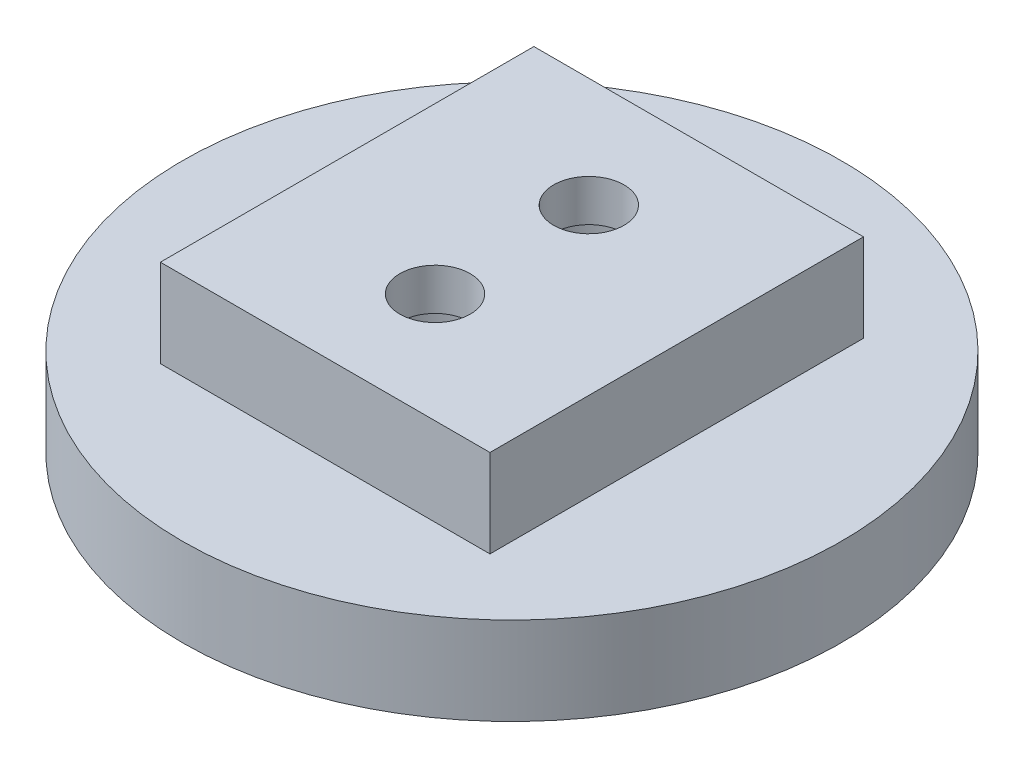
ISO-10303-21;
HEADER;
FILE_DESCRIPTION(('STEP AP214'),'2;1');
FILE_NAME('part.step','',(''),(''),'','','');
FILE_SCHEMA(('AUTOMOTIVE_DESIGN { 1 0 10303 214 1 1 1 1 }'));
ENDSEC;
DATA;
#1=APPLICATION_CONTEXT('core data for automotive mechanical design processes');
#2=APPLICATION_PROTOCOL_DEFINITION('international standard','automotive_design',2000,#1);
#3=PRODUCT_CONTEXT('',#1,'mechanical');
#4=PRODUCT('Part','Part','',(#3));
#5=PRODUCT_RELATED_PRODUCT_CATEGORY('part','',(#4));
#6=PRODUCT_DEFINITION_FORMATION('','',#4);
#7=PRODUCT_DEFINITION_CONTEXT('part definition',#1,'design');
#8=PRODUCT_DEFINITION('design','',#6,#7);
#9=PRODUCT_DEFINITION_SHAPE('','',#8);
#10=(LENGTH_UNIT() NAMED_UNIT(*) SI_UNIT(.MILLI.,.METRE.));
#11=(NAMED_UNIT(*) PLANE_ANGLE_UNIT() SI_UNIT($,.RADIAN.));
#12=(NAMED_UNIT(*) SI_UNIT($,.STERADIAN.) SOLID_ANGLE_UNIT());
#13=UNCERTAINTY_MEASURE_WITH_UNIT(LENGTH_MEASURE(1.E-05),#10,'distance_accuracy_value','');
#14=(GEOMETRIC_REPRESENTATION_CONTEXT(3) GLOBAL_UNCERTAINTY_ASSIGNED_CONTEXT((#13)) GLOBAL_UNIT_ASSIGNED_CONTEXT((#10,
#11,#12)) REPRESENTATION_CONTEXT('',''));
#15=CARTESIAN_POINT('',(0.,0.,0.));
#16=DIRECTION('',(0.,0.,1.));
#17=DIRECTION('',(1.,0.,0.));
#18=AXIS2_PLACEMENT_3D('',#15,#16,#17);
#19=CARTESIAN_POINT('',(0.,0.,0.));
#20=DIRECTION('',(0.,1.,0.));
#21=DIRECTION('',(0.,0.,1.));
#22=AXIS2_PLACEMENT_3D('',#19,#20,#21);
#23=PLANE('',#22);
#24=CARTESIAN_POINT('',(0.,0.,0.));
#25=DIRECTION('',(0.,1.,0.));
#26=DIRECTION('',(0.,0.,1.));
#27=AXIS2_PLACEMENT_3D('',#24,#25,#26);
#28=CIRCLE('',#27,15.);
#29=CARTESIAN_POINT('',(0.,0.,15.));
#30=VERTEX_POINT('',#29);
#31=EDGE_CURVE('E49',#30,#30,#28,.T.);
#32=ORIENTED_EDGE('',*,*,#31,.F.);
#33=EDGE_LOOP('',(#32));
#34=FACE_BOUND('',#33,.T.);
#35=CARTESIAN_POINT('',(0.,0.,3.5));
#36=DIRECTION('',(0.,-1.,0.));
#37=DIRECTION('',(0.,0.,-1.));
#38=AXIS2_PLACEMENT_3D('',#35,#36,#37);
#39=CIRCLE('',#38,2.95);
#40=CARTESIAN_POINT('',(0.,0.,0.55));
#41=VERTEX_POINT('',#40);
#42=EDGE_CURVE('E132',#41,#41,#39,.T.);
#43=ORIENTED_EDGE('',*,*,#42,.F.);
#44=EDGE_LOOP('',(#43));
#45=FACE_BOUND('',#44,.T.);
#46=CARTESIAN_POINT('',(0.,0.,-3.5));
#47=DIRECTION('',(0.,1.,0.));
#48=DIRECTION('',(0.,0.,1.));
#49=AXIS2_PLACEMENT_3D('',#46,#47,#48);
#50=CIRCLE('',#49,2.95);
#51=CARTESIAN_POINT('',(0.,0.,-0.55));
#52=VERTEX_POINT('',#51);
#53=EDGE_CURVE('E126',#52,#52,#50,.T.);
#54=ORIENTED_EDGE('',*,*,#53,.T.);
#55=EDGE_LOOP('',(#54));
#56=FACE_BOUND('',#55,.T.);
#57=ADVANCED_FACE('F39',(#34,#45,#56),#23,.F.);
#58=CARTESIAN_POINT('',(0.,0.,3.5));
#59=DIRECTION('',(0.,1.,0.));
#60=DIRECTION('',(0.,0.,1.));
#61=AXIS2_PLACEMENT_3D('',#58,#59,#60);
#62=CYLINDRICAL_SURFACE('',#61,1.6);
#63=CARTESIAN_POINT('',(0.,8.,3.5));
#64=DIRECTION('',(0.,-1.,0.));
#65=DIRECTION('',(0.,0.,-1.));
#66=AXIS2_PLACEMENT_3D('',#63,#64,#65);
#67=CIRCLE('',#66,1.6);
#68=CARTESIAN_POINT('',(0.,8.,1.9));
#69=VERTEX_POINT('',#68);
#70=EDGE_CURVE('E124',#69,#69,#67,.T.);
#71=ORIENTED_EDGE('',*,*,#70,.F.);
#72=EDGE_LOOP('',(#71));
#73=FACE_BOUND('',#72,.T.);
#74=CARTESIAN_POINT('',(0.,6.1,3.5));
#75=DIRECTION('',(0.,-1.,0.));
#76=DIRECTION('',(0.,0.,-1.));
#77=AXIS2_PLACEMENT_3D('',#74,#75,#76);
#78=CIRCLE('',#77,1.6);
#79=CARTESIAN_POINT('',(0.,6.1,1.9));
#80=VERTEX_POINT('',#79);
#81=EDGE_CURVE('E43',#80,#80,#78,.T.);
#82=ORIENTED_EDGE('',*,*,#81,.T.);
#83=EDGE_LOOP('',(#82));
#84=FACE_BOUND('',#83,.T.);
#85=ADVANCED_FACE('F184',(#73,#84),#62,.F.);
#86=CARTESIAN_POINT('',(0.,8.,0.));
#87=DIRECTION('',(0.,-1.,0.));
#88=DIRECTION('',(0.,0.,-1.));
#89=AXIS2_PLACEMENT_3D('',#86,#87,#88);
#90=PLANE('',#89);
#91=DIRECTION('',(0.,0.,-1.));
#92=VECTOR('',#91,1.);
#93=CARTESIAN_POINT('',(7.5,8.,8.5));
#94=LINE('',#93,#92);
#95=CARTESIAN_POINT('',(7.5,8.,8.5));
#96=VERTEX_POINT('',#95);
#97=CARTESIAN_POINT('',(7.5,8.,-8.5));
#98=VERTEX_POINT('',#97);
#99=EDGE_CURVE('E93',#96,#98,#94,.T.);
#100=ORIENTED_EDGE('',*,*,#99,.T.);
#101=DIRECTION('',(-1.,0.,0.));
#102=VECTOR('',#101,1.);
#103=CARTESIAN_POINT('',(-7.5,8.,-8.5));
#104=LINE('',#103,#102);
#105=CARTESIAN_POINT('',(-7.5,8.,-8.5));
#106=VERTEX_POINT('',#105);
#107=EDGE_CURVE('E81',#98,#106,#104,.T.);
#108=ORIENTED_EDGE('',*,*,#107,.T.);
#109=DIRECTION('',(0.,0.,1.));
#110=VECTOR('',#109,1.);
#111=CARTESIAN_POINT('',(-7.5,8.,8.5));
#112=LINE('',#111,#110);
#113=CARTESIAN_POINT('',(-7.5,8.,8.5));
#114=VERTEX_POINT('',#113);
#115=EDGE_CURVE('E92',#106,#114,#112,.T.);
#116=ORIENTED_EDGE('',*,*,#115,.T.);
#117=DIRECTION('',(1.,0.,0.));
#118=VECTOR('',#117,1.);
#119=CARTESIAN_POINT('',(-7.5,8.,8.5));
#120=LINE('',#119,#118);
#121=EDGE_CURVE('E99',#114,#96,#120,.T.);
#122=ORIENTED_EDGE('',*,*,#121,.T.);
#123=EDGE_LOOP('',(#100,#108,#116,#122));
#124=FACE_BOUND('',#123,.T.);
#125=ORIENTED_EDGE('',*,*,#70,.T.);
#126=EDGE_LOOP('',(#125));
#127=FACE_BOUND('',#126,.T.);
#128=CARTESIAN_POINT('',(0.,8.,-3.5));
#129=DIRECTION('',(0.,1.,0.));
#130=DIRECTION('',(0.,0.,1.));
#131=AXIS2_PLACEMENT_3D('',#128,#129,#130);
#132=CIRCLE('',#131,1.6);
#133=CARTESIAN_POINT('',(0.,8.,-1.9));
#134=VERTEX_POINT('',#133);
#135=EDGE_CURVE('E142',#134,#134,#132,.T.);
#136=ORIENTED_EDGE('',*,*,#135,.F.);
#137=EDGE_LOOP('',(#136));
#138=FACE_BOUND('',#137,.T.);
#139=ADVANCED_FACE('F96',(#124,#127,#138),#90,.F.);
#140=CARTESIAN_POINT('',(0.,4.,0.));
#141=DIRECTION('',(0.,-1.,0.));
#142=DIRECTION('',(0.,0.,-1.));
#143=AXIS2_PLACEMENT_3D('',#140,#141,#142);
#144=CYLINDRICAL_SURFACE('',#143,15.);
#145=CARTESIAN_POINT('',(0.,4.,0.));
#146=DIRECTION('',(0.,1.,0.));
#147=DIRECTION('',(0.,0.,1.));
#148=AXIS2_PLACEMENT_3D('',#145,#146,#147);
#149=CIRCLE('',#148,15.);
#150=CARTESIAN_POINT('',(0.,4.,15.));
#151=VERTEX_POINT('',#150);
#152=EDGE_CURVE('E11',#151,#151,#149,.T.);
#153=ORIENTED_EDGE('',*,*,#152,.F.);
#154=EDGE_LOOP('',(#153));
#155=FACE_BOUND('',#154,.T.);
#156=ORIENTED_EDGE('',*,*,#31,.T.);
#157=EDGE_LOOP('',(#156));
#158=FACE_BOUND('',#157,.T.);
#159=ADVANCED_FACE('F41',(#155,#158),#144,.T.);
#160=CARTESIAN_POINT('',(0.,4.,0.));
#161=DIRECTION('',(0.,1.,0.));
#162=DIRECTION('',(0.,0.,1.));
#163=AXIS2_PLACEMENT_3D('',#160,#161,#162);
#164=PLANE('',#163);
#165=DIRECTION('',(0.,0.,-1.));
#166=VECTOR('',#165,1.);
#167=CARTESIAN_POINT('',(7.5,4.,8.5));
#168=LINE('',#167,#166);
#169=CARTESIAN_POINT('',(7.5,4.,8.5));
#170=VERTEX_POINT('',#169);
#171=CARTESIAN_POINT('',(7.5,4.,-8.5));
#172=VERTEX_POINT('',#171);
#173=EDGE_CURVE('E57',#170,#172,#168,.T.);
#174=ORIENTED_EDGE('',*,*,#173,.F.);
#175=DIRECTION('',(1.,0.,0.));
#176=VECTOR('',#175,1.);
#177=CARTESIAN_POINT('',(-7.5,4.,8.5));
#178=LINE('',#177,#176);
#179=CARTESIAN_POINT('',(-7.5,4.,8.5));
#180=VERTEX_POINT('',#179);
#181=EDGE_CURVE('E61',#180,#170,#178,.T.);
#182=ORIENTED_EDGE('',*,*,#181,.F.);
#183=DIRECTION('',(0.,0.,1.));
#184=VECTOR('',#183,1.);
#185=CARTESIAN_POINT('',(-7.5,4.,8.5));
#186=LINE('',#185,#184);
#187=CARTESIAN_POINT('',(-7.5,4.,-8.5));
#188=VERTEX_POINT('',#187);
#189=EDGE_CURVE('E159',#188,#180,#186,.T.);
#190=ORIENTED_EDGE('',*,*,#189,.F.);
#191=DIRECTION('',(-1.,0.,0.));
#192=VECTOR('',#191,1.);
#193=CARTESIAN_POINT('',(-7.5,4.,-8.5));
#194=LINE('',#193,#192);
#195=EDGE_CURVE('E156',#172,#188,#194,.T.);
#196=ORIENTED_EDGE('',*,*,#195,.F.);
#197=EDGE_LOOP('',(#174,#182,#190,#196));
#198=FACE_BOUND('',#197,.T.);
#199=ORIENTED_EDGE('',*,*,#152,.T.);
#200=EDGE_LOOP('',(#199));
#201=FACE_BOUND('',#200,.T.);
#202=ADVANCED_FACE('F172',(#198,#201),#164,.T.);
#203=CARTESIAN_POINT('',(7.5,8.,8.5));
#204=DIRECTION('',(-1.,0.,0.));
#205=DIRECTION('',(0.,0.,1.));
#206=AXIS2_PLACEMENT_3D('',#203,#204,#205);
#207=PLANE('',#206);
#208=ORIENTED_EDGE('',*,*,#173,.T.);
#209=DIRECTION('',(0.,-1.,0.));
#210=VECTOR('',#209,1.);
#211=CARTESIAN_POINT('',(7.5,8.,-8.5));
#212=LINE('',#211,#210);
#213=EDGE_CURVE('E86',#98,#172,#212,.T.);
#214=ORIENTED_EDGE('',*,*,#213,.F.);
#215=ORIENTED_EDGE('',*,*,#99,.F.);
#216=DIRECTION('',(0.,-1.,0.));
#217=VECTOR('',#216,1.);
#218=CARTESIAN_POINT('',(7.5,8.,8.5));
#219=LINE('',#218,#217);
#220=EDGE_CURVE('E153',#96,#170,#219,.T.);
#221=ORIENTED_EDGE('',*,*,#220,.T.);
#222=EDGE_LOOP('',(#208,#214,#215,#221));
#223=FACE_BOUND('',#222,.T.);
#224=ADVANCED_FACE('F105',(#223),#207,.F.);
#225=CARTESIAN_POINT('',(-7.5,8.,-8.5));
#226=DIRECTION('',(0.,0.,1.));
#227=DIRECTION('',(1.,0.,0.));
#228=AXIS2_PLACEMENT_3D('',#225,#226,#227);
#229=PLANE('',#228);
#230=ORIENTED_EDGE('',*,*,#195,.T.);
#231=DIRECTION('',(0.,-1.,0.));
#232=VECTOR('',#231,1.);
#233=CARTESIAN_POINT('',(-7.5,8.,-8.5));
#234=LINE('',#233,#232);
#235=EDGE_CURVE('E88',#106,#188,#234,.T.);
#236=ORIENTED_EDGE('',*,*,#235,.F.);
#237=ORIENTED_EDGE('',*,*,#107,.F.);
#238=ORIENTED_EDGE('',*,*,#213,.T.);
#239=EDGE_LOOP('',(#230,#236,#237,#238));
#240=FACE_BOUND('',#239,.T.);
#241=ADVANCED_FACE('F84',(#240),#229,.F.);
#242=CARTESIAN_POINT('',(-7.5,8.,8.5));
#243=DIRECTION('',(1.,0.,0.));
#244=DIRECTION('',(0.,0.,-1.));
#245=AXIS2_PLACEMENT_3D('',#242,#243,#244);
#246=PLANE('',#245);
#247=ORIENTED_EDGE('',*,*,#189,.T.);
#248=DIRECTION('',(0.,-1.,0.));
#249=VECTOR('',#248,1.);
#250=CARTESIAN_POINT('',(-7.5,8.,8.5));
#251=LINE('',#250,#249);
#252=EDGE_CURVE('E112',#114,#180,#251,.T.);
#253=ORIENTED_EDGE('',*,*,#252,.F.);
#254=ORIENTED_EDGE('',*,*,#115,.F.);
#255=ORIENTED_EDGE('',*,*,#235,.T.);
#256=EDGE_LOOP('',(#247,#253,#254,#255));
#257=FACE_BOUND('',#256,.T.);
#258=ADVANCED_FACE('F171',(#257),#246,.F.);
#259=CARTESIAN_POINT('',(-7.5,8.,8.5));
#260=DIRECTION('',(0.,0.,-1.));
#261=DIRECTION('',(-1.,0.,0.));
#262=AXIS2_PLACEMENT_3D('',#259,#260,#261);
#263=PLANE('',#262);
#264=ORIENTED_EDGE('',*,*,#181,.T.);
#265=ORIENTED_EDGE('',*,*,#220,.F.);
#266=ORIENTED_EDGE('',*,*,#121,.F.);
#267=ORIENTED_EDGE('',*,*,#252,.T.);
#268=EDGE_LOOP('',(#264,#265,#266,#267));
#269=FACE_BOUND('',#268,.T.);
#270=ADVANCED_FACE('F169',(#269),#263,.F.);
#271=CARTESIAN_POINT('',(0.,0.,-3.5));
#272=DIRECTION('',(0.,1.,0.));
#273=DIRECTION('',(0.,0.,1.));
#274=AXIS2_PLACEMENT_3D('',#271,#272,#273);
#275=CYLINDRICAL_SURFACE('',#274,1.6);
#276=CARTESIAN_POINT('',(0.,6.1,-3.5));
#277=DIRECTION('',(0.,1.,0.));
#278=DIRECTION('',(0.,0.,1.));
#279=AXIS2_PLACEMENT_3D('',#276,#277,#278);
#280=CIRCLE('',#279,1.6);
#281=CARTESIAN_POINT('',(0.,6.1,-1.9));
#282=VERTEX_POINT('',#281);
#283=EDGE_CURVE('E115',#282,#282,#280,.F.);
#284=ORIENTED_EDGE('',*,*,#283,.T.);
#285=EDGE_LOOP('',(#284));
#286=FACE_BOUND('',#285,.T.);
#287=ORIENTED_EDGE('',*,*,#135,.T.);
#288=EDGE_LOOP('',(#287));
#289=FACE_BOUND('',#288,.T.);
#290=ADVANCED_FACE('F201',(#286,#289),#275,.F.);
#291=CARTESIAN_POINT('',(0.,6.1,-3.5));
#292=DIRECTION('',(0.,1.,0.));
#293=DIRECTION('',(0.,0.,1.));
#294=AXIS2_PLACEMENT_3D('',#291,#292,#293);
#295=PLANE('',#294);
#296=CARTESIAN_POINT('',(0.,6.1,-3.5));
#297=DIRECTION('',(0.,1.,0.));
#298=DIRECTION('',(0.,0.,1.));
#299=AXIS2_PLACEMENT_3D('',#296,#297,#298);
#300=CIRCLE('',#299,2.95);
#301=CARTESIAN_POINT('',(0.,6.1,-0.55));
#302=VERTEX_POINT('',#301);
#303=EDGE_CURVE('E118',#302,#302,#300,.T.);
#304=ORIENTED_EDGE('',*,*,#303,.F.);
#305=EDGE_LOOP('',(#304));
#306=FACE_BOUND('',#305,.T.);
#307=ORIENTED_EDGE('',*,*,#283,.F.);
#308=EDGE_LOOP('',(#307));
#309=FACE_BOUND('',#308,.T.);
#310=ADVANCED_FACE('F192',(#306,#309),#295,.F.);
#311=CARTESIAN_POINT('',(0.,6.1,-3.5));
#312=DIRECTION('',(0.,-1.,0.));
#313=DIRECTION('',(0.,0.,-1.));
#314=AXIS2_PLACEMENT_3D('',#311,#312,#313);
#315=CYLINDRICAL_SURFACE('',#314,2.95);
#316=ORIENTED_EDGE('',*,*,#303,.T.);
#317=EDGE_LOOP('',(#316));
#318=FACE_BOUND('',#317,.T.);
#319=ORIENTED_EDGE('',*,*,#53,.F.);
#320=EDGE_LOOP('',(#319));
#321=FACE_BOUND('',#320,.T.);
#322=ADVANCED_FACE('F189',(#318,#321),#315,.F.);
#323=CARTESIAN_POINT('',(0.,6.1,3.5));
#324=DIRECTION('',(0.,-1.,0.));
#325=DIRECTION('',(0.,0.,-1.));
#326=AXIS2_PLACEMENT_3D('',#323,#324,#325);
#327=CYLINDRICAL_SURFACE('',#326,2.95);
#328=CARTESIAN_POINT('',(0.,6.1,3.5));
#329=DIRECTION('',(0.,-1.,0.));
#330=DIRECTION('',(0.,0.,-1.));
#331=AXIS2_PLACEMENT_3D('',#328,#329,#330);
#332=CIRCLE('',#331,2.95);
#333=CARTESIAN_POINT('',(0.,6.1,0.55));
#334=VERTEX_POINT('',#333);
#335=EDGE_CURVE('E138',#334,#334,#332,.T.);
#336=ORIENTED_EDGE('',*,*,#335,.F.);
#337=EDGE_LOOP('',(#336));
#338=FACE_BOUND('',#337,.T.);
#339=ORIENTED_EDGE('',*,*,#42,.T.);
#340=EDGE_LOOP('',(#339));
#341=FACE_BOUND('',#340,.T.);
#342=ADVANCED_FACE('F191',(#338,#341),#327,.F.);
#343=CARTESIAN_POINT('',(0.,6.1,3.5));
#344=DIRECTION('',(0.,-1.,0.));
#345=DIRECTION('',(0.,0.,-1.));
#346=AXIS2_PLACEMENT_3D('',#343,#344,#345);
#347=PLANE('',#346);
#348=ORIENTED_EDGE('',*,*,#81,.F.);
#349=EDGE_LOOP('',(#348));
#350=FACE_BOUND('',#349,.T.);
#351=ORIENTED_EDGE('',*,*,#335,.T.);
#352=EDGE_LOOP('',(#351));
#353=FACE_BOUND('',#352,.T.);
#354=ADVANCED_FACE('F198',(#350,#353),#347,.T.);
#355=CLOSED_SHELL('',(#57,#85,#139,#159,#202,#224,#241,#258,#270,#290,#310,#322,#342,#354));
#356=MANIFOLD_SOLID_BREP('B2',#355);
#357=ADVANCED_BREP_SHAPE_REPRESENTATION('',(#18,#356),#14);
#358=SHAPE_DEFINITION_REPRESENTATION(#9,#357);
ENDSEC;
END-ISO-10303-21;
